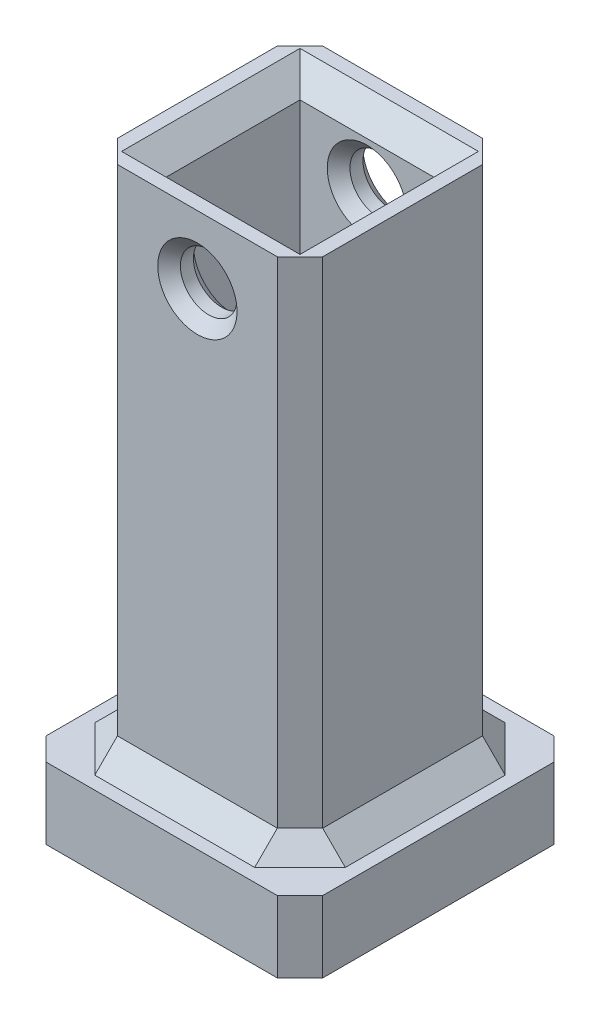
ISO-10303-21;
HEADER;
FILE_DESCRIPTION(('STEP AP214'),'2;1');
FILE_NAME('part.step','',(''),(''),'','','');
FILE_SCHEMA(('AUTOMOTIVE_DESIGN { 1 0 10303 214 1 1 1 1 }'));
ENDSEC;
DATA;
#1=APPLICATION_CONTEXT('core data for automotive mechanical design processes');
#2=APPLICATION_PROTOCOL_DEFINITION('international standard','automotive_design',2000,#1);
#3=PRODUCT_CONTEXT('',#1,'mechanical');
#4=PRODUCT('Part','Part','',(#3));
#5=PRODUCT_RELATED_PRODUCT_CATEGORY('part','',(#4));
#6=PRODUCT_DEFINITION_FORMATION('','',#4);
#7=PRODUCT_DEFINITION_CONTEXT('part definition',#1,'design');
#8=PRODUCT_DEFINITION('design','',#6,#7);
#9=PRODUCT_DEFINITION_SHAPE('','',#8);
#10=(LENGTH_UNIT() NAMED_UNIT(*) SI_UNIT(.MILLI.,.METRE.));
#11=(NAMED_UNIT(*) PLANE_ANGLE_UNIT() SI_UNIT($,.RADIAN.));
#12=(NAMED_UNIT(*) SI_UNIT($,.STERADIAN.) SOLID_ANGLE_UNIT());
#13=UNCERTAINTY_MEASURE_WITH_UNIT(LENGTH_MEASURE(1.E-05),#10,'distance_accuracy_value','');
#14=(GEOMETRIC_REPRESENTATION_CONTEXT(3) GLOBAL_UNCERTAINTY_ASSIGNED_CONTEXT((#13)) GLOBAL_UNIT_ASSIGNED_CONTEXT((#10,
#11,#12)) REPRESENTATION_CONTEXT('',''));
#15=CARTESIAN_POINT('',(0.,0.,0.));
#16=DIRECTION('',(0.,0.,1.));
#17=DIRECTION('',(1.,0.,0.));
#18=AXIS2_PLACEMENT_3D('',#15,#16,#17);
#19=CARTESIAN_POINT('',(0.,8.,0.));
#20=DIRECTION('',(0.,-1.,0.));
#21=DIRECTION('',(0.,0.,-1.));
#22=AXIS2_PLACEMENT_3D('',#19,#20,#21);
#23=PLANE('',#22);
#24=DIRECTION('',(1.,0.,0.));
#25=VECTOR('',#24,1.);
#26=CARTESIAN_POINT('',(15.5,8.,-15.5));
#27=LINE('',#26,#25);
#28=CARTESIAN_POINT('',(-12.96,8.,-15.5));
#29=VERTEX_POINT('',#28);
#30=CARTESIAN_POINT('',(12.96,8.,-15.5));
#31=VERTEX_POINT('',#30);
#32=EDGE_CURVE('E474',#29,#31,#27,.T.);
#33=ORIENTED_EDGE('',*,*,#32,.F.);
#34=DIRECTION('',(0.707106781186548,0.,-0.707106781186547));
#35=VECTOR('',#34,1.);
#36=CARTESIAN_POINT('',(-15.5,8.,-12.96));
#37=LINE('',#36,#35);
#38=CARTESIAN_POINT('',(-15.5,8.,-12.96));
#39=VERTEX_POINT('',#38);
#40=EDGE_CURVE('E238',#29,#39,#37,.F.);
#41=ORIENTED_EDGE('',*,*,#40,.T.);
#42=DIRECTION('',(0.,0.,-1.));
#43=VECTOR('',#42,1.);
#44=CARTESIAN_POINT('',(-15.5,8.,-15.5));
#45=LINE('',#44,#43);
#46=CARTESIAN_POINT('',(-15.5,8.,12.96));
#47=VERTEX_POINT('',#46);
#48=EDGE_CURVE('E344',#47,#39,#45,.T.);
#49=ORIENTED_EDGE('',*,*,#48,.F.);
#50=DIRECTION('',(-0.707106781186547,0.,-0.707106781186548));
#51=VECTOR('',#50,1.);
#52=CARTESIAN_POINT('',(-12.96,8.,15.5));
#53=LINE('',#52,#51);
#54=CARTESIAN_POINT('',(-12.96,8.,15.5));
#55=VERTEX_POINT('',#54);
#56=EDGE_CURVE('E462',#47,#55,#53,.F.);
#57=ORIENTED_EDGE('',*,*,#56,.T.);
#58=DIRECTION('',(-1.,0.,0.));
#59=VECTOR('',#58,1.);
#60=CARTESIAN_POINT('',(15.5,8.,15.5));
#61=LINE('',#60,#59);
#62=CARTESIAN_POINT('',(12.96,8.,15.5));
#63=VERTEX_POINT('',#62);
#64=EDGE_CURVE('E338',#63,#55,#61,.T.);
#65=ORIENTED_EDGE('',*,*,#64,.F.);
#66=DIRECTION('',(-0.707106781186548,0.,0.707106781186547));
#67=VECTOR('',#66,1.);
#68=CARTESIAN_POINT('',(15.5,8.,12.96));
#69=LINE('',#68,#67);
#70=CARTESIAN_POINT('',(15.5,8.,12.96));
#71=VERTEX_POINT('',#70);
#72=EDGE_CURVE('E464',#63,#71,#69,.F.);
#73=ORIENTED_EDGE('',*,*,#72,.T.);
#74=DIRECTION('',(0.,0.,1.));
#75=VECTOR('',#74,1.);
#76=CARTESIAN_POINT('',(15.5,8.,-15.5));
#77=LINE('',#76,#75);
#78=CARTESIAN_POINT('',(15.5,8.,-12.96));
#79=VERTEX_POINT('',#78);
#80=EDGE_CURVE('E497',#79,#71,#77,.T.);
#81=ORIENTED_EDGE('',*,*,#80,.F.);
#82=DIRECTION('',(0.707106781186547,0.,0.707106781186548));
#83=VECTOR('',#82,1.);
#84=CARTESIAN_POINT('',(12.96,8.,-15.5));
#85=LINE('',#84,#83);
#86=EDGE_CURVE('E466',#79,#31,#85,.F.);
#87=ORIENTED_EDGE('',*,*,#86,.T.);
#88=EDGE_LOOP('',(#33,#41,#49,#57,#65,#73,#81,#87));
#89=FACE_BOUND('',#88,.T.);
#90=DIRECTION('',(0.707106781186551,0.,0.707106781186544));
#91=VECTOR('',#90,1.);
#92=CARTESIAN_POINT('',(-8.95999999999999,8.,14.04));
#93=LINE('',#92,#91);
#94=CARTESIAN_POINT('',(-14.04,8.,8.96000000000002));
#95=VERTEX_POINT('',#94);
#96=CARTESIAN_POINT('',(-11.5,8.,11.5));
#97=VERTEX_POINT('',#96);
#98=EDGE_CURVE('E270',#95,#97,#93,.T.);
#99=ORIENTED_EDGE('',*,*,#98,.F.);
#100=DIRECTION('',(0.,0.,-1.));
#101=VECTOR('',#100,1.);
#102=CARTESIAN_POINT('',(-14.04,8.,-11.5));
#103=LINE('',#102,#101);
#104=CARTESIAN_POINT('',(-14.04,8.,-8.95999999999999));
#105=VERTEX_POINT('',#104);
#106=EDGE_CURVE('E264',#95,#105,#103,.T.);
#107=ORIENTED_EDGE('',*,*,#106,.T.);
#108=DIRECTION('',(-0.707106781186544,0.,0.707106781186551));
#109=VECTOR('',#108,1.);
#110=CARTESIAN_POINT('',(-14.04,8.,-8.95999999999999));
#111=LINE('',#110,#109);
#112=CARTESIAN_POINT('',(-11.5,8.,-11.5));
#113=VERTEX_POINT('',#112);
#114=EDGE_CURVE('E262',#113,#105,#111,.T.);
#115=ORIENTED_EDGE('',*,*,#114,.F.);
#116=DIRECTION('',(-0.707106781186544,0.,0.707106781186551));
#117=VECTOR('',#116,1.);
#118=CARTESIAN_POINT('',(-14.04,8.,-8.95999999999999));
#119=LINE('',#118,#117);
#120=CARTESIAN_POINT('',(-8.96000000000002,8.,-14.04));
#121=VERTEX_POINT('',#120);
#122=EDGE_CURVE('E251',#121,#113,#119,.T.);
#123=ORIENTED_EDGE('',*,*,#122,.F.);
#124=DIRECTION('',(1.,0.,0.));
#125=VECTOR('',#124,1.);
#126=CARTESIAN_POINT('',(11.5,8.,-14.04));
#127=LINE('',#126,#125);
#128=CARTESIAN_POINT('',(8.96000000000002,8.,-14.04));
#129=VERTEX_POINT('',#128);
#130=EDGE_CURVE('E234',#121,#129,#127,.T.);
#131=ORIENTED_EDGE('',*,*,#130,.T.);
#132=DIRECTION('',(-0.707106781186544,0.,-0.707106781186551));
#133=VECTOR('',#132,1.);
#134=CARTESIAN_POINT('',(8.96000000000002,8.,-14.04));
#135=LINE('',#134,#133);
#136=CARTESIAN_POINT('',(11.5,8.,-11.5));
#137=VERTEX_POINT('',#136);
#138=EDGE_CURVE('E229',#137,#129,#135,.T.);
#139=ORIENTED_EDGE('',*,*,#138,.F.);
#140=DIRECTION('',(-0.707106781186544,0.,-0.707106781186551));
#141=VECTOR('',#140,1.);
#142=CARTESIAN_POINT('',(8.96000000000002,8.,-14.04));
#143=LINE('',#142,#141);
#144=CARTESIAN_POINT('',(14.04,8.,-8.95999999999999));
#145=VERTEX_POINT('',#144);
#146=EDGE_CURVE('E231',#145,#137,#143,.T.);
#147=ORIENTED_EDGE('',*,*,#146,.F.);
#148=DIRECTION('',(0.,0.,1.));
#149=VECTOR('',#148,1.);
#150=CARTESIAN_POINT('',(14.04,8.,11.5));
#151=LINE('',#150,#149);
#152=CARTESIAN_POINT('',(14.04,8.,8.95999999999999));
#153=VERTEX_POINT('',#152);
#154=EDGE_CURVE('E246',#145,#153,#151,.T.);
#155=ORIENTED_EDGE('',*,*,#154,.T.);
#156=DIRECTION('',(0.707106781186544,0.,-0.707106781186551));
#157=VECTOR('',#156,1.);
#158=CARTESIAN_POINT('',(14.04,8.,8.95999999999999));
#159=LINE('',#158,#157);
#160=CARTESIAN_POINT('',(11.5,8.,11.5));
#161=VERTEX_POINT('',#160);
#162=EDGE_CURVE('E254',#161,#153,#159,.T.);
#163=ORIENTED_EDGE('',*,*,#162,.F.);
#164=DIRECTION('',(0.707106781186544,0.,-0.707106781186551));
#165=VECTOR('',#164,1.);
#166=CARTESIAN_POINT('',(14.04,8.,8.95999999999999));
#167=LINE('',#166,#165);
#168=CARTESIAN_POINT('',(8.96000000000002,8.,14.04));
#169=VERTEX_POINT('',#168);
#170=EDGE_CURVE('E257',#169,#161,#167,.T.);
#171=ORIENTED_EDGE('',*,*,#170,.F.);
#172=DIRECTION('',(-1.,0.,0.));
#173=VECTOR('',#172,1.);
#174=CARTESIAN_POINT('',(-11.5,8.,14.04));
#175=LINE('',#174,#173);
#176=CARTESIAN_POINT('',(-8.95999999999999,8.,14.04));
#177=VERTEX_POINT('',#176);
#178=EDGE_CURVE('E260',#169,#177,#175,.T.);
#179=ORIENTED_EDGE('',*,*,#178,.T.);
#180=DIRECTION('',(0.707106781186551,0.,0.707106781186544));
#181=VECTOR('',#180,1.);
#182=CARTESIAN_POINT('',(-8.95999999999999,8.,14.04));
#183=LINE('',#182,#181);
#184=EDGE_CURVE('E267',#97,#177,#183,.T.);
#185=ORIENTED_EDGE('',*,*,#184,.F.);
#186=EDGE_LOOP('',(#99,#107,#115,#123,#131,#139,#147,#155,#163,#171,#179,#185));
#187=FACE_BOUND('',#186,.T.);
#188=ADVANCED_FACE('F41',(#89,#187),#23,.F.);
#189=CARTESIAN_POINT('',(-11.5,66.,11.5));
#190=DIRECTION('',(1.,0.,0.));
#191=DIRECTION('',(0.,0.,-1.));
#192=AXIS2_PLACEMENT_3D('',#189,#190,#191);
#193=PLANE('',#192);
#194=DIRECTION('',(0.,0.,1.));
#195=VECTOR('',#194,1.);
#196=CARTESIAN_POINT('',(-11.5,66.,11.5));
#197=LINE('',#196,#195);
#198=CARTESIAN_POINT('',(-11.5,66.,-8.95999999999999));
#199=VERTEX_POINT('',#198);
#200=CARTESIAN_POINT('',(-11.5,66.,8.96000000000002));
#201=VERTEX_POINT('',#200);
#202=EDGE_CURVE('E366',#199,#201,#197,.T.);
#203=ORIENTED_EDGE('',*,*,#202,.F.);
#204=DIRECTION('',(0.,-1.,0.));
#205=VECTOR('',#204,1.);
#206=CARTESIAN_POINT('',(-11.5,66.,-8.95999999999999));
#207=LINE('',#206,#205);
#208=CARTESIAN_POINT('',(-11.5,10.54,-8.95999999999999));
#209=VERTEX_POINT('',#208);
#210=EDGE_CURVE('E433',#199,#209,#207,.T.);
#211=ORIENTED_EDGE('',*,*,#210,.T.);
#212=DIRECTION('',(0.,0.,1.));
#213=VECTOR('',#212,1.);
#214=CARTESIAN_POINT('',(-11.5,10.54,11.5));
#215=LINE('',#214,#213);
#216=CARTESIAN_POINT('',(-11.5,10.54,8.96000000000002));
#217=VERTEX_POINT('',#216);
#218=EDGE_CURVE('E429',#209,#217,#215,.T.);
#219=ORIENTED_EDGE('',*,*,#218,.T.);
#220=DIRECTION('',(0.,1.,0.));
#221=VECTOR('',#220,1.);
#222=CARTESIAN_POINT('',(-11.5,66.,8.96000000000002));
#223=LINE('',#222,#221);
#224=EDGE_CURVE('E431',#217,#201,#223,.T.);
#225=ORIENTED_EDGE('',*,*,#224,.T.);
#226=EDGE_LOOP('',(#203,#211,#219,#225));
#227=FACE_BOUND('',#226,.T.);
#228=ADVANCED_FACE('F512',(#227),#193,.F.);
#229=CARTESIAN_POINT('',(11.5,66.,11.5));
#230=DIRECTION('',(0.,0.,-1.));
#231=DIRECTION('',(-1.,0.,0.));
#232=AXIS2_PLACEMENT_3D('',#229,#230,#231);
#233=PLANE('',#232);
#234=CARTESIAN_POINT('',(0.,58.4199999999999,11.5));
#235=DIRECTION('',(0.,0.,-1.));
#236=DIRECTION('',(-1.,0.,0.));
#237=AXIS2_PLACEMENT_3D('',#234,#235,#236);
#238=CIRCLE('',#237,4.44499999999999);
#239=CARTESIAN_POINT('',(-4.44499999999999,58.4199999999999,11.5));
#240=VERTEX_POINT('',#239);
#241=EDGE_CURVE('E426',#240,#240,#238,.T.);
#242=ORIENTED_EDGE('',*,*,#241,.T.);
#243=EDGE_LOOP('',(#242));
#244=FACE_BOUND('',#243,.T.);
#245=DIRECTION('',(1.,0.,0.));
#246=VECTOR('',#245,1.);
#247=CARTESIAN_POINT('',(11.5,10.54,11.5));
#248=LINE('',#247,#246);
#249=CARTESIAN_POINT('',(-8.95999999999999,10.54,11.5));
#250=VERTEX_POINT('',#249);
#251=CARTESIAN_POINT('',(8.96000000000002,10.54,11.5));
#252=VERTEX_POINT('',#251);
#253=EDGE_CURVE('E456',#250,#252,#248,.T.);
#254=ORIENTED_EDGE('',*,*,#253,.T.);
#255=DIRECTION('',(0.,1.,0.));
#256=VECTOR('',#255,1.);
#257=CARTESIAN_POINT('',(8.96000000000002,66.,11.5));
#258=LINE('',#257,#256);
#259=CARTESIAN_POINT('',(8.96000000000002,66.,11.5));
#260=VERTEX_POINT('',#259);
#261=EDGE_CURVE('E460',#252,#260,#258,.T.);
#262=ORIENTED_EDGE('',*,*,#261,.T.);
#263=DIRECTION('',(1.,0.,0.));
#264=VECTOR('',#263,1.);
#265=CARTESIAN_POINT('',(11.5,66.,11.5));
#266=LINE('',#265,#264);
#267=CARTESIAN_POINT('',(-8.95999999999999,66.,11.5));
#268=VERTEX_POINT('',#267);
#269=EDGE_CURVE('E369',#268,#260,#266,.T.);
#270=ORIENTED_EDGE('',*,*,#269,.F.);
#271=DIRECTION('',(0.,-1.,0.));
#272=VECTOR('',#271,1.);
#273=CARTESIAN_POINT('',(-8.95999999999999,66.,11.5));
#274=LINE('',#273,#272);
#275=EDGE_CURVE('E458',#268,#250,#274,.T.);
#276=ORIENTED_EDGE('',*,*,#275,.T.);
#277=EDGE_LOOP('',(#254,#262,#270,#276));
#278=FACE_BOUND('',#277,.T.);
#279=ADVANCED_FACE('F518',(#244,#278),#233,.F.);
#280=CARTESIAN_POINT('',(11.5,66.,11.5));
#281=DIRECTION('',(-1.,0.,0.));
#282=DIRECTION('',(0.,0.,1.));
#283=AXIS2_PLACEMENT_3D('',#280,#281,#282);
#284=PLANE('',#283);
#285=DIRECTION('',(0.,0.,-1.));
#286=VECTOR('',#285,1.);
#287=CARTESIAN_POINT('',(11.5,10.54,-11.5));
#288=LINE('',#287,#286);
#289=CARTESIAN_POINT('',(11.5,10.54,8.95999999999999));
#290=VERTEX_POINT('',#289);
#291=CARTESIAN_POINT('',(11.5,10.54,-8.95999999999999));
#292=VERTEX_POINT('',#291);
#293=EDGE_CURVE('E450',#290,#292,#288,.T.);
#294=ORIENTED_EDGE('',*,*,#293,.T.);
#295=DIRECTION('',(0.,1.,0.));
#296=VECTOR('',#295,1.);
#297=CARTESIAN_POINT('',(11.5,66.,-8.95999999999999));
#298=LINE('',#297,#296);
#299=CARTESIAN_POINT('',(11.5,66.,-8.95999999999999));
#300=VERTEX_POINT('',#299);
#301=EDGE_CURVE('E454',#292,#300,#298,.T.);
#302=ORIENTED_EDGE('',*,*,#301,.T.);
#303=DIRECTION('',(0.,0.,-1.));
#304=VECTOR('',#303,1.);
#305=CARTESIAN_POINT('',(11.5,66.,11.5));
#306=LINE('',#305,#304);
#307=CARTESIAN_POINT('',(11.5,66.,8.95999999999999));
#308=VERTEX_POINT('',#307);
#309=EDGE_CURVE('E372',#308,#300,#306,.T.);
#310=ORIENTED_EDGE('',*,*,#309,.F.);
#311=DIRECTION('',(0.,-1.,0.));
#312=VECTOR('',#311,1.);
#313=CARTESIAN_POINT('',(11.5,66.,8.95999999999999));
#314=LINE('',#313,#312);
#315=EDGE_CURVE('E452',#308,#290,#314,.T.);
#316=ORIENTED_EDGE('',*,*,#315,.T.);
#317=EDGE_LOOP('',(#294,#302,#310,#316));
#318=FACE_BOUND('',#317,.T.);
#319=ADVANCED_FACE('F560',(#318),#284,.F.);
#320=CARTESIAN_POINT('',(11.5,66.,-11.5));
#321=DIRECTION('',(0.,0.,1.));
#322=DIRECTION('',(1.,0.,0.));
#323=AXIS2_PLACEMENT_3D('',#320,#321,#322);
#324=PLANE('',#323);
#325=CARTESIAN_POINT('',(0.,58.4199999999999,-11.5));
#326=DIRECTION('',(0.,0.,1.));
#327=DIRECTION('',(1.,0.,0.));
#328=AXIS2_PLACEMENT_3D('',#325,#326,#327);
#329=CIRCLE('',#328,4.445);
#330=CARTESIAN_POINT('',(4.445,58.4199999999999,-11.5));
#331=VERTEX_POINT('',#330);
#332=EDGE_CURVE('E396',#331,#331,#329,.T.);
#333=ORIENTED_EDGE('',*,*,#332,.T.);
#334=EDGE_LOOP('',(#333));
#335=FACE_BOUND('',#334,.T.);
#336=DIRECTION('',(-1.,0.,0.));
#337=VECTOR('',#336,1.);
#338=CARTESIAN_POINT('',(-11.5,10.54,-11.5));
#339=LINE('',#338,#337);
#340=CARTESIAN_POINT('',(8.96000000000002,10.54,-11.5));
#341=VERTEX_POINT('',#340);
#342=CARTESIAN_POINT('',(-8.96000000000002,10.54,-11.5));
#343=VERTEX_POINT('',#342);
#344=EDGE_CURVE('E436',#341,#343,#339,.T.);
#345=ORIENTED_EDGE('',*,*,#344,.T.);
#346=DIRECTION('',(0.,1.,0.));
#347=VECTOR('',#346,1.);
#348=CARTESIAN_POINT('',(-8.96000000000002,66.,-11.5));
#349=LINE('',#348,#347);
#350=CARTESIAN_POINT('',(-8.96000000000002,66.,-11.5));
#351=VERTEX_POINT('',#350);
#352=EDGE_CURVE('E440',#343,#351,#349,.T.);
#353=ORIENTED_EDGE('',*,*,#352,.T.);
#354=DIRECTION('',(-1.,0.,0.));
#355=VECTOR('',#354,1.);
#356=CARTESIAN_POINT('',(11.5,66.,-11.5));
#357=LINE('',#356,#355);
#358=CARTESIAN_POINT('',(8.96000000000002,66.,-11.5));
#359=VERTEX_POINT('',#358);
#360=EDGE_CURVE('E375',#359,#351,#357,.T.);
#361=ORIENTED_EDGE('',*,*,#360,.F.);
#362=DIRECTION('',(0.,-1.,0.));
#363=VECTOR('',#362,1.);
#364=CARTESIAN_POINT('',(8.96000000000002,66.,-11.5));
#365=LINE('',#364,#363);
#366=EDGE_CURVE('E438',#359,#341,#365,.T.);
#367=ORIENTED_EDGE('',*,*,#366,.T.);
#368=EDGE_LOOP('',(#345,#353,#361,#367));
#369=FACE_BOUND('',#368,.T.);
#370=ADVANCED_FACE('F553',(#335,#369),#324,.F.);
#371=CARTESIAN_POINT('',(0.,66.,0.));
#372=DIRECTION('',(0.,1.,0.));
#373=DIRECTION('',(0.,0.,1.));
#374=AXIS2_PLACEMENT_3D('',#371,#372,#373);
#375=PLANE('',#374);
#376=DIRECTION('',(0.,0.,-1.));
#377=VECTOR('',#376,1.);
#378=CARTESIAN_POINT('',(-10.,66.,0.));
#379=LINE('',#378,#377);
#380=CARTESIAN_POINT('',(-10.,66.,10.));
#381=VERTEX_POINT('',#380);
#382=CARTESIAN_POINT('',(-10.,66.,-10.));
#383=VERTEX_POINT('',#382);
#384=EDGE_CURVE('E385',#381,#383,#379,.T.);
#385=ORIENTED_EDGE('',*,*,#384,.T.);
#386=DIRECTION('',(1.,0.,0.));
#387=VECTOR('',#386,1.);
#388=CARTESIAN_POINT('',(0.,66.,-10.));
#389=LINE('',#388,#387);
#390=CARTESIAN_POINT('',(10.,66.,-10.));
#391=VERTEX_POINT('',#390);
#392=EDGE_CURVE('E387',#383,#391,#389,.T.);
#393=ORIENTED_EDGE('',*,*,#392,.T.);
#394=DIRECTION('',(0.,0.,1.));
#395=VECTOR('',#394,1.);
#396=CARTESIAN_POINT('',(10.,66.,0.));
#397=LINE('',#396,#395);
#398=CARTESIAN_POINT('',(10.,66.,10.));
#399=VERTEX_POINT('',#398);
#400=EDGE_CURVE('E381',#391,#399,#397,.T.);
#401=ORIENTED_EDGE('',*,*,#400,.T.);
#402=DIRECTION('',(-1.,0.,0.));
#403=VECTOR('',#402,1.);
#404=CARTESIAN_POINT('',(0.,66.,10.));
#405=LINE('',#404,#403);
#406=EDGE_CURVE('E383',#399,#381,#405,.T.);
#407=ORIENTED_EDGE('',*,*,#406,.T.);
#408=EDGE_LOOP('',(#385,#393,#401,#407));
#409=FACE_BOUND('',#408,.T.);
#410=ORIENTED_EDGE('',*,*,#360,.T.);
#411=DIRECTION('',(0.707106781186544,0.,-0.707106781186551));
#412=VECTOR('',#411,1.);
#413=CARTESIAN_POINT('',(-10.2300000000001,66.,-10.2299999999999));
#414=LINE('',#413,#412);
#415=EDGE_CURVE('E448',#351,#199,#414,.F.);
#416=ORIENTED_EDGE('',*,*,#415,.T.);
#417=ORIENTED_EDGE('',*,*,#202,.T.);
#418=DIRECTION('',(-0.707106781186551,0.,-0.707106781186544));
#419=VECTOR('',#418,1.);
#420=CARTESIAN_POINT('',(-10.2299999999999,66.,10.2300000000001));
#421=LINE('',#420,#419);
#422=EDGE_CURVE('E442',#201,#268,#421,.F.);
#423=ORIENTED_EDGE('',*,*,#422,.T.);
#424=ORIENTED_EDGE('',*,*,#269,.T.);
#425=DIRECTION('',(-0.707106781186544,0.,0.707106781186551));
#426=VECTOR('',#425,1.);
#427=CARTESIAN_POINT('',(10.2300000000001,66.,10.2299999999999));
#428=LINE('',#427,#426);
#429=EDGE_CURVE('E444',#260,#308,#428,.F.);
#430=ORIENTED_EDGE('',*,*,#429,.T.);
#431=ORIENTED_EDGE('',*,*,#309,.T.);
#432=DIRECTION('',(0.707106781186544,0.,0.707106781186551));
#433=VECTOR('',#432,1.);
#434=CARTESIAN_POINT('',(10.2300000000001,66.,-10.2299999999999));
#435=LINE('',#434,#433);
#436=EDGE_CURVE('E446',#300,#359,#435,.F.);
#437=ORIENTED_EDGE('',*,*,#436,.T.);
#438=EDGE_LOOP('',(#410,#416,#417,#423,#424,#430,#431,#437));
#439=FACE_BOUND('',#438,.T.);
#440=ADVANCED_FACE('F550',(#409,#439),#375,.T.);
#441=CARTESIAN_POINT('',(0.,0.,0.));
#442=DIRECTION('',(0.,1.,0.));
#443=DIRECTION('',(0.,0.,1.));
#444=AXIS2_PLACEMENT_3D('',#441,#442,#443);
#445=PLANE('',#444);
#446=DIRECTION('',(0.,0.,1.));
#447=VECTOR('',#446,1.);
#448=CARTESIAN_POINT('',(-7.5,0.,7.5));
#449=LINE('',#448,#447);
#450=CARTESIAN_POINT('',(-7.5,0.,-7.5));
#451=VERTEX_POINT('',#450);
#452=CARTESIAN_POINT('',(-7.5,0.,7.5));
#453=VERTEX_POINT('',#452);
#454=EDGE_CURVE('E345',#451,#453,#449,.T.);
#455=ORIENTED_EDGE('',*,*,#454,.T.);
#456=DIRECTION('',(1.,0.,0.));
#457=VECTOR('',#456,1.);
#458=CARTESIAN_POINT('',(7.5,0.,7.5));
#459=LINE('',#458,#457);
#460=CARTESIAN_POINT('',(7.5,0.,7.5));
#461=VERTEX_POINT('',#460);
#462=EDGE_CURVE('E348',#453,#461,#459,.T.);
#463=ORIENTED_EDGE('',*,*,#462,.T.);
#464=DIRECTION('',(0.,0.,-1.));
#465=VECTOR('',#464,1.);
#466=CARTESIAN_POINT('',(7.5,0.,7.5));
#467=LINE('',#466,#465);
#468=CARTESIAN_POINT('',(7.5,0.,-7.5));
#469=VERTEX_POINT('',#468);
#470=EDGE_CURVE('E352',#461,#469,#467,.T.);
#471=ORIENTED_EDGE('',*,*,#470,.T.);
#472=DIRECTION('',(-1.,0.,0.));
#473=VECTOR('',#472,1.);
#474=CARTESIAN_POINT('',(7.5,0.,-7.5));
#475=LINE('',#474,#473);
#476=EDGE_CURVE('E355',#469,#451,#475,.T.);
#477=ORIENTED_EDGE('',*,*,#476,.T.);
#478=EDGE_LOOP('',(#455,#463,#471,#477));
#479=FACE_BOUND('',#478,.T.);
#480=DIRECTION('',(0.,0.,-1.));
#481=VECTOR('',#480,1.);
#482=CARTESIAN_POINT('',(-15.5,0.,-15.5));
#483=LINE('',#482,#481);
#484=CARTESIAN_POINT('',(-15.5,0.,12.96));
#485=VERTEX_POINT('',#484);
#486=CARTESIAN_POINT('',(-15.5,0.,-12.96));
#487=VERTEX_POINT('',#486);
#488=EDGE_CURVE('E326',#485,#487,#483,.T.);
#489=ORIENTED_EDGE('',*,*,#488,.T.);
#490=DIRECTION('',(-0.707106781186548,0.,0.707106781186547));
#491=VECTOR('',#490,1.);
#492=CARTESIAN_POINT('',(-15.5,0.,-12.96));
#493=LINE('',#492,#491);
#494=CARTESIAN_POINT('',(-12.96,0.,-15.5));
#495=VERTEX_POINT('',#494);
#496=EDGE_CURVE('E282',#487,#495,#493,.F.);
#497=ORIENTED_EDGE('',*,*,#496,.T.);
#498=DIRECTION('',(1.,0.,0.));
#499=VECTOR('',#498,1.);
#500=CARTESIAN_POINT('',(15.5,0.,-15.5));
#501=LINE('',#500,#499);
#502=CARTESIAN_POINT('',(12.96,0.,-15.5));
#503=VERTEX_POINT('',#502);
#504=EDGE_CURVE('E331',#495,#503,#501,.T.);
#505=ORIENTED_EDGE('',*,*,#504,.T.);
#506=DIRECTION('',(-0.707106781186547,0.,-0.707106781186548));
#507=VECTOR('',#506,1.);
#508=CARTESIAN_POINT('',(12.96,0.,-15.5));
#509=LINE('',#508,#507);
#510=CARTESIAN_POINT('',(15.5,0.,-12.96));
#511=VERTEX_POINT('',#510);
#512=EDGE_CURVE('E280',#503,#511,#509,.F.);
#513=ORIENTED_EDGE('',*,*,#512,.T.);
#514=DIRECTION('',(0.,0.,1.));
#515=VECTOR('',#514,1.);
#516=CARTESIAN_POINT('',(15.5,0.,-15.5));
#517=LINE('',#516,#515);
#518=CARTESIAN_POINT('',(15.5,0.,12.96));
#519=VERTEX_POINT('',#518);
#520=EDGE_CURVE('E335',#511,#519,#517,.T.);
#521=ORIENTED_EDGE('',*,*,#520,.T.);
#522=DIRECTION('',(0.707106781186548,0.,-0.707106781186547));
#523=VECTOR('',#522,1.);
#524=CARTESIAN_POINT('',(15.5,0.,12.96));
#525=LINE('',#524,#523);
#526=CARTESIAN_POINT('',(12.96,0.,15.5));
#527=VERTEX_POINT('',#526);
#528=EDGE_CURVE('E67',#519,#527,#525,.F.);
#529=ORIENTED_EDGE('',*,*,#528,.T.);
#530=DIRECTION('',(-1.,0.,0.));
#531=VECTOR('',#530,1.);
#532=CARTESIAN_POINT('',(15.5,0.,15.5));
#533=LINE('',#532,#531);
#534=CARTESIAN_POINT('',(-12.96,0.,15.5));
#535=VERTEX_POINT('',#534);
#536=EDGE_CURVE('E342',#527,#535,#533,.T.);
#537=ORIENTED_EDGE('',*,*,#536,.T.);
#538=DIRECTION('',(0.707106781186547,0.,0.707106781186548));
#539=VECTOR('',#538,1.);
#540=CARTESIAN_POINT('',(-12.96,0.,15.5));
#541=LINE('',#540,#539);
#542=EDGE_CURVE('E59',#535,#485,#541,.F.);
#543=ORIENTED_EDGE('',*,*,#542,.T.);
#544=EDGE_LOOP('',(#489,#497,#505,#513,#521,#529,#537,#543));
#545=FACE_BOUND('',#544,.T.);
#546=ADVANCED_FACE('F483',(#479,#545),#445,.F.);
#547=CARTESIAN_POINT('',(-7.5,66.,7.5));
#548=DIRECTION('',(1.,0.,0.));
#549=DIRECTION('',(0.,0.,-1.));
#550=AXIS2_PLACEMENT_3D('',#547,#548,#549);
#551=PLANE('',#550);
#552=DIRECTION('',(0.,-1.,0.));
#553=VECTOR('',#552,1.);
#554=CARTESIAN_POINT('',(-7.5,66.,-7.5));
#555=LINE('',#554,#553);
#556=CARTESIAN_POINT('',(-7.5,63.5,-7.5));
#557=VERTEX_POINT('',#556);
#558=EDGE_CURVE('E358',#557,#451,#555,.T.);
#559=ORIENTED_EDGE('',*,*,#558,.F.);
#560=DIRECTION('',(0.,0.,1.));
#561=VECTOR('',#560,1.);
#562=CARTESIAN_POINT('',(-7.5,63.5,7.5));
#563=LINE('',#562,#561);
#564=CARTESIAN_POINT('',(-7.5,63.5,7.5));
#565=VERTEX_POINT('',#564);
#566=EDGE_CURVE('E390',#557,#565,#563,.T.);
#567=ORIENTED_EDGE('',*,*,#566,.T.);
#568=DIRECTION('',(0.,-1.,0.));
#569=VECTOR('',#568,1.);
#570=CARTESIAN_POINT('',(-7.5,66.,7.5));
#571=LINE('',#570,#569);
#572=EDGE_CURVE('E364',#565,#453,#571,.T.);
#573=ORIENTED_EDGE('',*,*,#572,.T.);
#574=ORIENTED_EDGE('',*,*,#454,.F.);
#575=EDGE_LOOP('',(#559,#567,#573,#574));
#576=FACE_BOUND('',#575,.T.);
#577=ADVANCED_FACE('F545',(#576),#551,.T.);
#578=CARTESIAN_POINT('',(7.5,66.,7.5));
#579=DIRECTION('',(0.,0.,-1.));
#580=DIRECTION('',(-1.,0.,0.));
#581=AXIS2_PLACEMENT_3D('',#578,#579,#580);
#582=PLANE('',#581);
#583=CARTESIAN_POINT('',(0.,58.4199999999999,7.5));
#584=DIRECTION('',(0.,0.,-1.));
#585=DIRECTION('',(-1.,0.,0.));
#586=AXIS2_PLACEMENT_3D('',#583,#584,#585);
#587=CIRCLE('',#586,4.44500000000002);
#588=CARTESIAN_POINT('',(-4.44500000000002,58.4199999999999,7.5));
#589=VERTEX_POINT('',#588);
#590=EDGE_CURVE('E423',#589,#589,#587,.F.);
#591=ORIENTED_EDGE('',*,*,#590,.T.);
#592=EDGE_LOOP('',(#591));
#593=FACE_BOUND('',#592,.T.);
#594=ORIENTED_EDGE('',*,*,#572,.F.);
#595=DIRECTION('',(1.,0.,0.));
#596=VECTOR('',#595,1.);
#597=CARTESIAN_POINT('',(7.5,63.5,7.5));
#598=LINE('',#597,#596);
#599=CARTESIAN_POINT('',(7.5,63.5,7.5));
#600=VERTEX_POINT('',#599);
#601=EDGE_CURVE('E392',#565,#600,#598,.T.);
#602=ORIENTED_EDGE('',*,*,#601,.T.);
#603=DIRECTION('',(0.,-1.,0.));
#604=VECTOR('',#603,1.);
#605=CARTESIAN_POINT('',(7.5,66.,7.5));
#606=LINE('',#605,#604);
#607=EDGE_CURVE('E362',#600,#461,#606,.T.);
#608=ORIENTED_EDGE('',*,*,#607,.T.);
#609=ORIENTED_EDGE('',*,*,#462,.F.);
#610=EDGE_LOOP('',(#594,#602,#608,#609));
#611=FACE_BOUND('',#610,.T.);
#612=ADVANCED_FACE('F541',(#593,#611),#582,.T.);
#613=CARTESIAN_POINT('',(7.5,66.,7.5));
#614=DIRECTION('',(-1.,0.,0.));
#615=DIRECTION('',(0.,0.,1.));
#616=AXIS2_PLACEMENT_3D('',#613,#614,#615);
#617=PLANE('',#616);
#618=ORIENTED_EDGE('',*,*,#607,.F.);
#619=DIRECTION('',(0.,0.,-1.));
#620=VECTOR('',#619,1.);
#621=CARTESIAN_POINT('',(7.5,63.5,7.5));
#622=LINE('',#621,#620);
#623=CARTESIAN_POINT('',(7.5,63.5,-7.5));
#624=VERTEX_POINT('',#623);
#625=EDGE_CURVE('E394',#600,#624,#622,.T.);
#626=ORIENTED_EDGE('',*,*,#625,.T.);
#627=DIRECTION('',(0.,-1.,0.));
#628=VECTOR('',#627,1.);
#629=CARTESIAN_POINT('',(7.5,66.,-7.5));
#630=LINE('',#629,#628);
#631=EDGE_CURVE('E360',#624,#469,#630,.T.);
#632=ORIENTED_EDGE('',*,*,#631,.T.);
#633=ORIENTED_EDGE('',*,*,#470,.F.);
#634=EDGE_LOOP('',(#618,#626,#632,#633));
#635=FACE_BOUND('',#634,.T.);
#636=ADVANCED_FACE('F537',(#635),#617,.T.);
#637=CARTESIAN_POINT('',(7.5,66.,-7.5));
#638=DIRECTION('',(0.,0.,1.));
#639=DIRECTION('',(1.,0.,0.));
#640=AXIS2_PLACEMENT_3D('',#637,#638,#639);
#641=PLANE('',#640);
#642=CARTESIAN_POINT('',(0.,58.4199999999999,-7.5));
#643=DIRECTION('',(0.,0.,1.));
#644=DIRECTION('',(1.,0.,0.));
#645=AXIS2_PLACEMENT_3D('',#642,#643,#644);
#646=CIRCLE('',#645,4.445);
#647=CARTESIAN_POINT('',(4.445,58.4199999999999,-7.5));
#648=VERTEX_POINT('',#647);
#649=EDGE_CURVE('E414',#648,#648,#646,.F.);
#650=ORIENTED_EDGE('',*,*,#649,.T.);
#651=EDGE_LOOP('',(#650));
#652=FACE_BOUND('',#651,.T.);
#653=ORIENTED_EDGE('',*,*,#631,.F.);
#654=DIRECTION('',(-1.,0.,0.));
#655=VECTOR('',#654,1.);
#656=CARTESIAN_POINT('',(7.5,63.5,-7.5));
#657=LINE('',#656,#655);
#658=EDGE_CURVE('E378',#624,#557,#657,.T.);
#659=ORIENTED_EDGE('',*,*,#658,.T.);
#660=ORIENTED_EDGE('',*,*,#558,.T.);
#661=ORIENTED_EDGE('',*,*,#476,.F.);
#662=EDGE_LOOP('',(#653,#659,#660,#661));
#663=FACE_BOUND('',#662,.T.);
#664=ADVANCED_FACE('F533',(#652,#663),#641,.T.);
#665=CARTESIAN_POINT('',(7.5,63.5,7.5));
#666=DIRECTION('',(0.,-0.70710678118655,0.707106781186544));
#667=DIRECTION('',(1.,0.,0.));
#668=AXIS2_PLACEMENT_3D('',#665,#666,#667);
#669=PLANE('',#668);
#670=DIRECTION('',(-0.577350269189627,0.577350269189623,0.577350269189627));
#671=VECTOR('',#670,1.);
#672=CARTESIAN_POINT('',(-7.5,63.5,7.5));
#673=LINE('',#672,#671);
#674=EDGE_CURVE('E401',#381,#565,#673,.F.);
#675=ORIENTED_EDGE('',*,*,#674,.F.);
#676=ORIENTED_EDGE('',*,*,#406,.F.);
#677=DIRECTION('',(0.577350269189627,0.577350269189623,0.577350269189627));
#678=VECTOR('',#677,1.);
#679=CARTESIAN_POINT('',(7.5,63.5,7.5));
#680=LINE('',#679,#678);
#681=EDGE_CURVE('E349',#600,#399,#680,.T.);
#682=ORIENTED_EDGE('',*,*,#681,.F.);
#683=ORIENTED_EDGE('',*,*,#601,.F.);
#684=EDGE_LOOP('',(#675,#676,#682,#683));
#685=FACE_BOUND('',#684,.T.);
#686=ADVANCED_FACE('F536',(#685),#669,.F.);
#687=CARTESIAN_POINT('',(7.5,63.5,7.5));
#688=DIRECTION('',(0.707106781186544,-0.70710678118655,0.));
#689=DIRECTION('',(0.,0.,-1.));
#690=AXIS2_PLACEMENT_3D('',#687,#688,#689);
#691=PLANE('',#690);
#692=ORIENTED_EDGE('',*,*,#681,.T.);
#693=ORIENTED_EDGE('',*,*,#400,.F.);
#694=DIRECTION('',(-0.577350269189627,-0.577350269189623,0.577350269189627));
#695=VECTOR('',#694,1.);
#696=CARTESIAN_POINT('',(7.5,63.5,-7.5));
#697=LINE('',#696,#695);
#698=EDGE_CURVE('E399',#624,#391,#697,.F.);
#699=ORIENTED_EDGE('',*,*,#698,.F.);
#700=ORIENTED_EDGE('',*,*,#625,.F.);
#701=EDGE_LOOP('',(#692,#693,#699,#700));
#702=FACE_BOUND('',#701,.T.);
#703=ADVANCED_FACE('F582',(#702),#691,.F.);
#704=CARTESIAN_POINT('',(-7.5,63.5,7.5));
#705=DIRECTION('',(-0.707106781186544,-0.70710678118655,0.));
#706=DIRECTION('',(0.,0.,1.));
#707=AXIS2_PLACEMENT_3D('',#704,#705,#706);
#708=PLANE('',#707);
#709=ORIENTED_EDGE('',*,*,#674,.T.);
#710=ORIENTED_EDGE('',*,*,#566,.F.);
#711=DIRECTION('',(-0.577350269189627,0.577350269189623,-0.577350269189627));
#712=VECTOR('',#711,1.);
#713=CARTESIAN_POINT('',(-2.49999999999997,58.5,-2.49999999999997));
#714=LINE('',#713,#712);
#715=EDGE_CURVE('E397',#383,#557,#714,.F.);
#716=ORIENTED_EDGE('',*,*,#715,.F.);
#717=ORIENTED_EDGE('',*,*,#384,.F.);
#718=EDGE_LOOP('',(#709,#710,#716,#717));
#719=FACE_BOUND('',#718,.T.);
#720=ADVANCED_FACE('F575',(#719),#708,.F.);
#721=CARTESIAN_POINT('',(7.5,63.5,-7.5));
#722=DIRECTION('',(0.,-0.70710678118655,-0.707106781186544));
#723=DIRECTION('',(-1.,0.,0.));
#724=AXIS2_PLACEMENT_3D('',#721,#722,#723);
#725=PLANE('',#724);
#726=ORIENTED_EDGE('',*,*,#698,.T.);
#727=ORIENTED_EDGE('',*,*,#392,.F.);
#728=ORIENTED_EDGE('',*,*,#715,.T.);
#729=ORIENTED_EDGE('',*,*,#658,.F.);
#730=EDGE_LOOP('',(#726,#727,#728,#729));
#731=FACE_BOUND('',#730,.T.);
#732=ADVANCED_FACE('F532',(#731),#725,.F.);
#733=CARTESIAN_POINT('',(-15.5,8.,-15.5));
#734=DIRECTION('',(-1.,0.,0.));
#735=DIRECTION('',(0.,0.,1.));
#736=AXIS2_PLACEMENT_3D('',#733,#734,#735);
#737=PLANE('',#736);
#738=ORIENTED_EDGE('',*,*,#48,.T.);
#739=DIRECTION('',(0.,-1.,0.));
#740=VECTOR('',#739,1.);
#741=CARTESIAN_POINT('',(-15.5,8.,-12.96));
#742=LINE('',#741,#740);
#743=EDGE_CURVE('E275',#39,#487,#742,.T.);
#744=ORIENTED_EDGE('',*,*,#743,.T.);
#745=ORIENTED_EDGE('',*,*,#488,.F.);
#746=DIRECTION('',(0.,1.,0.));
#747=VECTOR('',#746,1.);
#748=CARTESIAN_POINT('',(-15.5,8.,12.96));
#749=LINE('',#748,#747);
#750=EDGE_CURVE('E273',#485,#47,#749,.T.);
#751=ORIENTED_EDGE('',*,*,#750,.T.);
#752=EDGE_LOOP('',(#738,#744,#745,#751));
#753=FACE_BOUND('',#752,.T.);
#754=ADVANCED_FACE('F479',(#753),#737,.T.);
#755=CARTESIAN_POINT('',(15.5,8.,15.5));
#756=DIRECTION('',(0.,0.,1.));
#757=DIRECTION('',(1.,0.,0.));
#758=AXIS2_PLACEMENT_3D('',#755,#756,#757);
#759=PLANE('',#758);
#760=ORIENTED_EDGE('',*,*,#536,.F.);
#761=DIRECTION('',(0.,1.,0.));
#762=VECTOR('',#761,1.);
#763=CARTESIAN_POINT('',(12.96,8.,15.5));
#764=LINE('',#763,#762);
#765=EDGE_CURVE('E11',#527,#63,#764,.T.);
#766=ORIENTED_EDGE('',*,*,#765,.T.);
#767=ORIENTED_EDGE('',*,*,#64,.T.);
#768=DIRECTION('',(0.,-1.,0.));
#769=VECTOR('',#768,1.);
#770=CARTESIAN_POINT('',(-12.96,8.,15.5));
#771=LINE('',#770,#769);
#772=EDGE_CURVE('E51',#55,#535,#771,.T.);
#773=ORIENTED_EDGE('',*,*,#772,.T.);
#774=EDGE_LOOP('',(#760,#766,#767,#773));
#775=FACE_BOUND('',#774,.T.);
#776=ADVANCED_FACE('F505',(#775),#759,.T.);
#777=CARTESIAN_POINT('',(15.5,8.,-15.5));
#778=DIRECTION('',(1.,0.,0.));
#779=DIRECTION('',(0.,0.,-1.));
#780=AXIS2_PLACEMENT_3D('',#777,#778,#779);
#781=PLANE('',#780);
#782=ORIENTED_EDGE('',*,*,#520,.F.);
#783=DIRECTION('',(0.,1.,0.));
#784=VECTOR('',#783,1.);
#785=CARTESIAN_POINT('',(15.5,8.,-12.96));
#786=LINE('',#785,#784);
#787=EDGE_CURVE('E292',#511,#79,#786,.T.);
#788=ORIENTED_EDGE('',*,*,#787,.T.);
#789=ORIENTED_EDGE('',*,*,#80,.T.);
#790=DIRECTION('',(0.,-1.,0.));
#791=VECTOR('',#790,1.);
#792=CARTESIAN_POINT('',(15.5,8.,12.96));
#793=LINE('',#792,#791);
#794=EDGE_CURVE('E289',#71,#519,#793,.T.);
#795=ORIENTED_EDGE('',*,*,#794,.T.);
#796=EDGE_LOOP('',(#782,#788,#789,#795));
#797=FACE_BOUND('',#796,.T.);
#798=ADVANCED_FACE('F493',(#797),#781,.T.);
#799=CARTESIAN_POINT('',(15.5,8.,-15.5));
#800=DIRECTION('',(0.,0.,-1.));
#801=DIRECTION('',(-1.,0.,0.));
#802=AXIS2_PLACEMENT_3D('',#799,#800,#801);
#803=PLANE('',#802);
#804=ORIENTED_EDGE('',*,*,#504,.F.);
#805=DIRECTION('',(0.,1.,0.));
#806=VECTOR('',#805,1.);
#807=CARTESIAN_POINT('',(-12.96,8.,-15.5));
#808=LINE('',#807,#806);
#809=EDGE_CURVE('E287',#495,#29,#808,.T.);
#810=ORIENTED_EDGE('',*,*,#809,.T.);
#811=ORIENTED_EDGE('',*,*,#32,.T.);
#812=DIRECTION('',(0.,-1.,0.));
#813=VECTOR('',#812,1.);
#814=CARTESIAN_POINT('',(12.96,8.,-15.5));
#815=LINE('',#814,#813);
#816=EDGE_CURVE('E284',#31,#503,#815,.T.);
#817=ORIENTED_EDGE('',*,*,#816,.T.);
#818=EDGE_LOOP('',(#804,#810,#811,#817));
#819=FACE_BOUND('',#818,.T.);
#820=ADVANCED_FACE('F485',(#819),#803,.T.);
#821=CARTESIAN_POINT('',(0.,58.4199999999999,-15.5));
#822=DIRECTION('',(0.,0.,1.));
#823=DIRECTION('',(1.,0.,0.));
#824=AXIS2_PLACEMENT_3D('',#821,#822,#823);
#825=CYLINDRICAL_SURFACE('',#824,3.17499999999999);
#826=CARTESIAN_POINT('',(0.,58.4199999999999,-10.23));
#827=DIRECTION('',(0.,0.,1.));
#828=DIRECTION('',(1.,0.,0.));
#829=AXIS2_PLACEMENT_3D('',#826,#827,#828);
#830=CIRCLE('',#829,3.17499999999999);
#831=CARTESIAN_POINT('',(3.17499999999999,58.4199999999999,-10.23));
#832=VERTEX_POINT('',#831);
#833=EDGE_CURVE('E411',#832,#832,#830,.F.);
#834=ORIENTED_EDGE('',*,*,#833,.T.);
#835=EDGE_LOOP('',(#834));
#836=FACE_BOUND('',#835,.T.);
#837=CARTESIAN_POINT('',(0.,58.4199999999999,-8.77000000000001));
#838=DIRECTION('',(0.,0.,1.));
#839=DIRECTION('',(1.,0.,0.));
#840=AXIS2_PLACEMENT_3D('',#837,#838,#839);
#841=CIRCLE('',#840,3.17499999999999);
#842=CARTESIAN_POINT('',(3.17499999999999,58.4199999999999,-8.77000000000001));
#843=VERTEX_POINT('',#842);
#844=EDGE_CURVE('E408',#843,#843,#841,.T.);
#845=ORIENTED_EDGE('',*,*,#844,.T.);
#846=EDGE_LOOP('',(#845));
#847=FACE_BOUND('',#846,.T.);
#848=ADVANCED_FACE('F523',(#836,#847),#825,.F.);
#849=CARTESIAN_POINT('',(0.,58.4199999999999,8.77000000000002));
#850=DIRECTION('',(0.,0.,-1.));
#851=DIRECTION('',(-1.,0.,0.));
#852=AXIS2_PLACEMENT_3D('',#849,#850,#851);
#853=CIRCLE('',#852,3.17499999999999);
#854=CARTESIAN_POINT('',(-3.17499999999999,58.4199999999999,8.77000000000002));
#855=VERTEX_POINT('',#854);
#856=EDGE_CURVE('E420',#855,#855,#853,.T.);
#857=ORIENTED_EDGE('',*,*,#856,.T.);
#858=EDGE_LOOP('',(#857));
#859=FACE_BOUND('',#858,.T.);
#860=CARTESIAN_POINT('',(0.,58.4199999999999,10.23));
#861=DIRECTION('',(0.,0.,-1.));
#862=DIRECTION('',(-1.,0.,0.));
#863=AXIS2_PLACEMENT_3D('',#860,#861,#862);
#864=CIRCLE('',#863,3.17499999999999);
#865=CARTESIAN_POINT('',(-3.17499999999999,58.4199999999999,10.23));
#866=VERTEX_POINT('',#865);
#867=EDGE_CURVE('E417',#866,#866,#864,.F.);
#868=ORIENTED_EDGE('',*,*,#867,.T.);
#869=EDGE_LOOP('',(#868));
#870=FACE_BOUND('',#869,.T.);
#871=ADVANCED_FACE('F602',(#859,#870),#825,.F.);
#872=CARTESIAN_POINT('',(0.,58.4199999999999,-11.5));
#873=DIRECTION('',(0.,0.,-1.));
#874=DIRECTION('',(-1.,0.,0.));
#875=AXIS2_PLACEMENT_3D('',#872,#873,#874);
#876=CONICAL_SURFACE('',#875,4.445,0.785398163397447);
#877=ORIENTED_EDGE('',*,*,#833,.F.);
#878=EDGE_LOOP('',(#877));
#879=FACE_BOUND('',#878,.T.);
#880=ORIENTED_EDGE('',*,*,#332,.F.);
#881=EDGE_LOOP('',(#880));
#882=FACE_BOUND('',#881,.T.);
#883=ADVANCED_FACE('F595',(#879,#882),#876,.F.);
#884=CARTESIAN_POINT('',(0.,58.4199999999999,-8.77000000000001));
#885=DIRECTION('',(0.,0.,1.));
#886=DIRECTION('',(1.,0.,0.));
#887=AXIS2_PLACEMENT_3D('',#884,#885,#886);
#888=CONICAL_SURFACE('',#887,3.17499999999999,0.78539816339745);
#889=ORIENTED_EDGE('',*,*,#649,.F.);
#890=EDGE_LOOP('',(#889));
#891=FACE_BOUND('',#890,.T.);
#892=ORIENTED_EDGE('',*,*,#844,.F.);
#893=EDGE_LOOP('',(#892));
#894=FACE_BOUND('',#893,.T.);
#895=ADVANCED_FACE('F601',(#891,#894),#888,.F.);
#896=CARTESIAN_POINT('',(0.,58.4199999999999,8.77000000000002));
#897=DIRECTION('',(0.,0.,-1.));
#898=DIRECTION('',(-1.,0.,0.));
#899=AXIS2_PLACEMENT_3D('',#896,#897,#898);
#900=CONICAL_SURFACE('',#899,3.17499999999999,0.78539816339745);
#901=ORIENTED_EDGE('',*,*,#590,.F.);
#902=EDGE_LOOP('',(#901));
#903=FACE_BOUND('',#902,.T.);
#904=ORIENTED_EDGE('',*,*,#856,.F.);
#905=EDGE_LOOP('',(#904));
#906=FACE_BOUND('',#905,.T.);
#907=ADVANCED_FACE('F609',(#903,#906),#900,.F.);
#908=CARTESIAN_POINT('',(0.,58.4199999999999,10.23));
#909=DIRECTION('',(0.,0.,1.));
#910=DIRECTION('',(1.,0.,0.));
#911=AXIS2_PLACEMENT_3D('',#908,#909,#910);
#912=CONICAL_SURFACE('',#911,3.17499999999999,0.785398163397451);
#913=ORIENTED_EDGE('',*,*,#241,.F.);
#914=EDGE_LOOP('',(#913));
#915=FACE_BOUND('',#914,.T.);
#916=ORIENTED_EDGE('',*,*,#867,.F.);
#917=EDGE_LOOP('',(#916));
#918=FACE_BOUND('',#917,.T.);
#919=ADVANCED_FACE('F616',(#915,#918),#912,.F.);
#920=CARTESIAN_POINT('',(11.5,66.,8.95999999999999));
#921=DIRECTION('',(-0.707106781186551,0.,-0.707106781186544));
#922=DIRECTION('',(0.,-1.,0.));
#923=AXIS2_PLACEMENT_3D('',#920,#921,#922);
#924=PLANE('',#923);
#925=DIRECTION('',(0.707106781186544,0.,-0.707106781186551));
#926=VECTOR('',#925,1.);
#927=CARTESIAN_POINT('',(11.5,10.54,8.95999999999999));
#928=LINE('',#927,#926);
#929=EDGE_CURVE('E46',#290,#252,#928,.F.);
#930=ORIENTED_EDGE('',*,*,#929,.F.);
#931=ORIENTED_EDGE('',*,*,#315,.F.);
#932=ORIENTED_EDGE('',*,*,#429,.F.);
#933=ORIENTED_EDGE('',*,*,#261,.F.);
#934=EDGE_LOOP('',(#930,#931,#932,#933));
#935=FACE_BOUND('',#934,.T.);
#936=ADVANCED_FACE('F622',(#935),#924,.F.);
#937=CARTESIAN_POINT('',(11.5,10.54,8.95999999999999));
#938=DIRECTION('',(-0.577350269189626,-0.577350269189632,-0.577350269189619));
#939=DIRECTION('',(0.707106781186551,-0.707106781186544,0.));
#940=AXIS2_PLACEMENT_3D('',#937,#938,#939);
#941=PLANE('',#940);
#942=DIRECTION('',(-0.707106781186551,0.707106781186544,0.));
#943=VECTOR('',#942,1.);
#944=CARTESIAN_POINT('',(14.04,8.,8.95999999999999));
#945=LINE('',#944,#943);
#946=EDGE_CURVE('E317',#290,#153,#945,.F.);
#947=ORIENTED_EDGE('',*,*,#946,.F.);
#948=ORIENTED_EDGE('',*,*,#929,.T.);
#949=DIRECTION('',(0.,-0.707106781186544,0.707106781186551));
#950=VECTOR('',#949,1.);
#951=CARTESIAN_POINT('',(8.96000000000002,10.54,11.5));
#952=LINE('',#951,#950);
#953=EDGE_CURVE('E319',#169,#252,#952,.F.);
#954=ORIENTED_EDGE('',*,*,#953,.F.);
#955=ORIENTED_EDGE('',*,*,#170,.T.);
#956=ORIENTED_EDGE('',*,*,#162,.T.);
#957=EDGE_LOOP('',(#947,#948,#954,#955,#956));
#958=FACE_BOUND('',#957,.T.);
#959=ADVANCED_FACE('F692',(#958),#941,.F.);
#960=CARTESIAN_POINT('',(-8.95999999999999,66.,11.5));
#961=DIRECTION('',(0.707106781186544,0.,-0.707106781186551));
#962=DIRECTION('',(0.,-1.,0.));
#963=AXIS2_PLACEMENT_3D('',#960,#961,#962);
#964=PLANE('',#963);
#965=ORIENTED_EDGE('',*,*,#422,.F.);
#966=ORIENTED_EDGE('',*,*,#224,.F.);
#967=DIRECTION('',(0.707106781186551,0.,0.707106781186544));
#968=VECTOR('',#967,1.);
#969=CARTESIAN_POINT('',(-8.95999999999999,10.54,11.5));
#970=LINE('',#969,#968);
#971=EDGE_CURVE('E314',#250,#217,#970,.F.);
#972=ORIENTED_EDGE('',*,*,#971,.F.);
#973=ORIENTED_EDGE('',*,*,#275,.F.);
#974=EDGE_LOOP('',(#965,#966,#972,#973));
#975=FACE_BOUND('',#974,.T.);
#976=ADVANCED_FACE('F686',(#975),#964,.F.);
#977=CARTESIAN_POINT('',(0.,8.,14.04));
#978=DIRECTION('',(0.,0.707106781186551,0.707106781186544));
#979=DIRECTION('',(1.,0.,0.));
#980=AXIS2_PLACEMENT_3D('',#977,#978,#979);
#981=PLANE('',#980);
#982=ORIENTED_EDGE('',*,*,#953,.T.);
#983=ORIENTED_EDGE('',*,*,#253,.F.);
#984=DIRECTION('',(0.,0.707106781186544,-0.707106781186551));
#985=VECTOR('',#984,1.);
#986=CARTESIAN_POINT('',(-8.95999999999999,8.,14.04));
#987=LINE('',#986,#985);
#988=EDGE_CURVE('E311',#177,#250,#987,.T.);
#989=ORIENTED_EDGE('',*,*,#988,.F.);
#990=ORIENTED_EDGE('',*,*,#178,.F.);
#991=EDGE_LOOP('',(#982,#983,#989,#990));
#992=FACE_BOUND('',#991,.T.);
#993=ADVANCED_FACE('F679',(#992),#981,.T.);
#994=CARTESIAN_POINT('',(14.04,8.,0.));
#995=DIRECTION('',(0.707106781186544,0.707106781186551,0.));
#996=DIRECTION('',(0.,0.,-1.));
#997=AXIS2_PLACEMENT_3D('',#994,#995,#996);
#998=PLANE('',#997);
#999=ORIENTED_EDGE('',*,*,#946,.T.);
#1000=ORIENTED_EDGE('',*,*,#154,.F.);
#1001=DIRECTION('',(0.707106781186551,-0.707106781186544,0.));
#1002=VECTOR('',#1001,1.);
#1003=CARTESIAN_POINT('',(11.5,10.54,-8.95999999999999));
#1004=LINE('',#1003,#1002);
#1005=EDGE_CURVE('E244',#292,#145,#1004,.T.);
#1006=ORIENTED_EDGE('',*,*,#1005,.F.);
#1007=ORIENTED_EDGE('',*,*,#293,.F.);
#1008=EDGE_LOOP('',(#999,#1000,#1006,#1007));
#1009=FACE_BOUND('',#1008,.T.);
#1010=ADVANCED_FACE('F672',(#1009),#998,.T.);
#1011=CARTESIAN_POINT('',(8.96000000000002,66.,-11.5));
#1012=DIRECTION('',(-0.707106781186551,0.,0.707106781186544));
#1013=DIRECTION('',(0.,-1.,0.));
#1014=AXIS2_PLACEMENT_3D('',#1011,#1012,#1013);
#1015=PLANE('',#1014);
#1016=ORIENTED_EDGE('',*,*,#436,.F.);
#1017=ORIENTED_EDGE('',*,*,#301,.F.);
#1018=DIRECTION('',(-0.707106781186544,0.,-0.707106781186551));
#1019=VECTOR('',#1018,1.);
#1020=CARTESIAN_POINT('',(8.96000000000002,10.54,-11.5));
#1021=LINE('',#1020,#1019);
#1022=EDGE_CURVE('E308',#341,#292,#1021,.F.);
#1023=ORIENTED_EDGE('',*,*,#1022,.F.);
#1024=ORIENTED_EDGE('',*,*,#366,.F.);
#1025=EDGE_LOOP('',(#1016,#1017,#1023,#1024));
#1026=FACE_BOUND('',#1025,.T.);
#1027=ADVANCED_FACE('F665',(#1026),#1015,.F.);
#1028=CARTESIAN_POINT('',(-8.95999999999999,10.54,11.5));
#1029=DIRECTION('',(0.577350269189619,-0.577350269189632,-0.577350269189626));
#1030=DIRECTION('',(0.,0.707106781186544,-0.707106781186551));
#1031=AXIS2_PLACEMENT_3D('',#1028,#1029,#1030);
#1032=PLANE('',#1031);
#1033=ORIENTED_EDGE('',*,*,#988,.T.);
#1034=ORIENTED_EDGE('',*,*,#971,.T.);
#1035=DIRECTION('',(-0.707106781186551,-0.707106781186544,0.));
#1036=VECTOR('',#1035,1.);
#1037=CARTESIAN_POINT('',(-11.5,10.54,8.96000000000002));
#1038=LINE('',#1037,#1036);
#1039=EDGE_CURVE('E305',#95,#217,#1038,.F.);
#1040=ORIENTED_EDGE('',*,*,#1039,.F.);
#1041=ORIENTED_EDGE('',*,*,#98,.T.);
#1042=ORIENTED_EDGE('',*,*,#184,.T.);
#1043=EDGE_LOOP('',(#1033,#1034,#1040,#1041,#1042));
#1044=FACE_BOUND('',#1043,.T.);
#1045=ADVANCED_FACE('F659',(#1044),#1032,.F.);
#1046=CARTESIAN_POINT('',(8.96000000000002,10.54,-11.5));
#1047=DIRECTION('',(-0.577350269189628,-0.577350269189628,0.577350269189622));
#1048=DIRECTION('',(0.707106781186547,-0.707106781186547,0.));
#1049=AXIS2_PLACEMENT_3D('',#1046,#1047,#1048);
#1050=PLANE('',#1049);
#1051=ORIENTED_EDGE('',*,*,#146,.T.);
#1052=ORIENTED_EDGE('',*,*,#138,.T.);
#1053=DIRECTION('',(0.,0.707106781186544,0.707106781186551));
#1054=VECTOR('',#1053,1.);
#1055=CARTESIAN_POINT('',(8.96000000000002,8.,-14.04));
#1056=LINE('',#1055,#1054);
#1057=EDGE_CURVE('E303',#341,#129,#1056,.F.);
#1058=ORIENTED_EDGE('',*,*,#1057,.F.);
#1059=ORIENTED_EDGE('',*,*,#1022,.T.);
#1060=ORIENTED_EDGE('',*,*,#1005,.T.);
#1061=EDGE_LOOP('',(#1051,#1052,#1058,#1059,#1060));
#1062=FACE_BOUND('',#1061,.T.);
#1063=ADVANCED_FACE('F241',(#1062),#1050,.F.);
#1064=CARTESIAN_POINT('',(-14.04,8.,0.));
#1065=DIRECTION('',(-0.707106781186544,0.707106781186551,0.));
#1066=DIRECTION('',(0.,0.,1.));
#1067=AXIS2_PLACEMENT_3D('',#1064,#1065,#1066);
#1068=PLANE('',#1067);
#1069=ORIENTED_EDGE('',*,*,#1039,.T.);
#1070=ORIENTED_EDGE('',*,*,#218,.F.);
#1071=DIRECTION('',(0.707106781186551,0.707106781186544,0.));
#1072=VECTOR('',#1071,1.);
#1073=CARTESIAN_POINT('',(-14.04,8.,-8.95999999999999));
#1074=LINE('',#1073,#1072);
#1075=EDGE_CURVE('E300',#105,#209,#1074,.T.);
#1076=ORIENTED_EDGE('',*,*,#1075,.F.);
#1077=ORIENTED_EDGE('',*,*,#106,.F.);
#1078=EDGE_LOOP('',(#1069,#1070,#1076,#1077));
#1079=FACE_BOUND('',#1078,.T.);
#1080=ADVANCED_FACE('F646',(#1079),#1068,.T.);
#1081=CARTESIAN_POINT('',(0.,8.,-14.04));
#1082=DIRECTION('',(0.,0.707106781186551,-0.707106781186544));
#1083=DIRECTION('',(-1.,0.,0.));
#1084=AXIS2_PLACEMENT_3D('',#1081,#1082,#1083);
#1085=PLANE('',#1084);
#1086=ORIENTED_EDGE('',*,*,#1057,.T.);
#1087=ORIENTED_EDGE('',*,*,#130,.F.);
#1088=DIRECTION('',(0.,-0.707106781186544,-0.707106781186551));
#1089=VECTOR('',#1088,1.);
#1090=CARTESIAN_POINT('',(-8.96000000000002,10.54,-11.5));
#1091=LINE('',#1090,#1089);
#1092=EDGE_CURVE('E297',#343,#121,#1091,.T.);
#1093=ORIENTED_EDGE('',*,*,#1092,.F.);
#1094=ORIENTED_EDGE('',*,*,#344,.F.);
#1095=EDGE_LOOP('',(#1086,#1087,#1093,#1094));
#1096=FACE_BOUND('',#1095,.T.);
#1097=ADVANCED_FACE('F639',(#1096),#1085,.T.);
#1098=CARTESIAN_POINT('',(-11.5,10.54,-8.95999999999999));
#1099=DIRECTION('',(0.577350269189626,-0.577350269189632,0.577350269189619));
#1100=DIRECTION('',(0.707106781186551,0.707106781186544,0.));
#1101=AXIS2_PLACEMENT_3D('',#1098,#1099,#1100);
#1102=PLANE('',#1101);
#1103=ORIENTED_EDGE('',*,*,#114,.T.);
#1104=ORIENTED_EDGE('',*,*,#1075,.T.);
#1105=DIRECTION('',(-0.707106781186544,0.,0.707106781186551));
#1106=VECTOR('',#1105,1.);
#1107=CARTESIAN_POINT('',(-11.5,10.54,-8.95999999999999));
#1108=LINE('',#1107,#1106);
#1109=EDGE_CURVE('E295',#343,#209,#1108,.T.);
#1110=ORIENTED_EDGE('',*,*,#1109,.F.);
#1111=ORIENTED_EDGE('',*,*,#1092,.T.);
#1112=ORIENTED_EDGE('',*,*,#122,.T.);
#1113=EDGE_LOOP('',(#1103,#1104,#1110,#1111,#1112));
#1114=FACE_BOUND('',#1113,.T.);
#1115=ADVANCED_FACE('F632',(#1114),#1102,.F.);
#1116=CARTESIAN_POINT('',(-11.5,66.,-8.95999999999999));
#1117=DIRECTION('',(0.707106781186551,0.,0.707106781186544));
#1118=DIRECTION('',(0.,-1.,0.));
#1119=AXIS2_PLACEMENT_3D('',#1116,#1117,#1118);
#1120=PLANE('',#1119);
#1121=ORIENTED_EDGE('',*,*,#415,.F.);
#1122=ORIENTED_EDGE('',*,*,#352,.F.);
#1123=ORIENTED_EDGE('',*,*,#1109,.T.);
#1124=ORIENTED_EDGE('',*,*,#210,.F.);
#1125=EDGE_LOOP('',(#1121,#1122,#1123,#1124));
#1126=FACE_BOUND('',#1125,.T.);
#1127=ADVANCED_FACE('F625',(#1126),#1120,.F.);
#1128=CARTESIAN_POINT('',(-15.5,8.,-12.96));
#1129=DIRECTION('',(0.707106781186547,0.,0.707106781186548));
#1130=DIRECTION('',(0.,-1.,0.));
#1131=AXIS2_PLACEMENT_3D('',#1128,#1129,#1130);
#1132=PLANE('',#1131);
#1133=ORIENTED_EDGE('',*,*,#40,.F.);
#1134=ORIENTED_EDGE('',*,*,#809,.F.);
#1135=ORIENTED_EDGE('',*,*,#496,.F.);
#1136=ORIENTED_EDGE('',*,*,#743,.F.);
#1137=EDGE_LOOP('',(#1133,#1134,#1135,#1136));
#1138=FACE_BOUND('',#1137,.T.);
#1139=ADVANCED_FACE('F481',(#1138),#1132,.F.);
#1140=CARTESIAN_POINT('',(12.96,8.,-15.5));
#1141=DIRECTION('',(-0.707106781186548,0.,0.707106781186547));
#1142=DIRECTION('',(0.,-1.,0.));
#1143=AXIS2_PLACEMENT_3D('',#1140,#1141,#1142);
#1144=PLANE('',#1143);
#1145=ORIENTED_EDGE('',*,*,#86,.F.);
#1146=ORIENTED_EDGE('',*,*,#787,.F.);
#1147=ORIENTED_EDGE('',*,*,#512,.F.);
#1148=ORIENTED_EDGE('',*,*,#816,.F.);
#1149=EDGE_LOOP('',(#1145,#1146,#1147,#1148));
#1150=FACE_BOUND('',#1149,.T.);
#1151=ADVANCED_FACE('F489',(#1150),#1144,.F.);
#1152=CARTESIAN_POINT('',(15.5,8.,12.96));
#1153=DIRECTION('',(-0.707106781186547,0.,-0.707106781186548));
#1154=DIRECTION('',(0.,-1.,0.));
#1155=AXIS2_PLACEMENT_3D('',#1152,#1153,#1154);
#1156=PLANE('',#1155);
#1157=ORIENTED_EDGE('',*,*,#72,.F.);
#1158=ORIENTED_EDGE('',*,*,#765,.F.);
#1159=ORIENTED_EDGE('',*,*,#528,.F.);
#1160=ORIENTED_EDGE('',*,*,#794,.F.);
#1161=EDGE_LOOP('',(#1157,#1158,#1159,#1160));
#1162=FACE_BOUND('',#1161,.T.);
#1163=ADVANCED_FACE('F500',(#1162),#1156,.F.);
#1164=CARTESIAN_POINT('',(-12.96,8.,15.5));
#1165=DIRECTION('',(0.707106781186548,0.,-0.707106781186547));
#1166=DIRECTION('',(0.,-1.,0.));
#1167=AXIS2_PLACEMENT_3D('',#1164,#1165,#1166);
#1168=PLANE('',#1167);
#1169=ORIENTED_EDGE('',*,*,#56,.F.);
#1170=ORIENTED_EDGE('',*,*,#750,.F.);
#1171=ORIENTED_EDGE('',*,*,#542,.F.);
#1172=ORIENTED_EDGE('',*,*,#772,.F.);
#1173=EDGE_LOOP('',(#1169,#1170,#1171,#1172));
#1174=FACE_BOUND('',#1173,.T.);
#1175=ADVANCED_FACE('F44',(#1174),#1168,.F.);
#1176=CLOSED_SHELL('',(#188,#228,#279,#319,#370,#440,#546,#577,#612,#636,#664,#686,#703,#720,
#732,#754,#776,#798,#820,#848,#871,#883,#895,#907,#919,#936,#959,#976,#993,#1010,#1027,#1045,
#1063,#1080,#1097,#1115,#1127,#1139,#1151,#1163,#1175));
#1177=MANIFOLD_SOLID_BREP('B2',#1176);
#1178=ADVANCED_BREP_SHAPE_REPRESENTATION('',(#18,#1177),#14);
#1179=SHAPE_DEFINITION_REPRESENTATION(#9,#1178);
ENDSEC;
END-ISO-10303-21;
